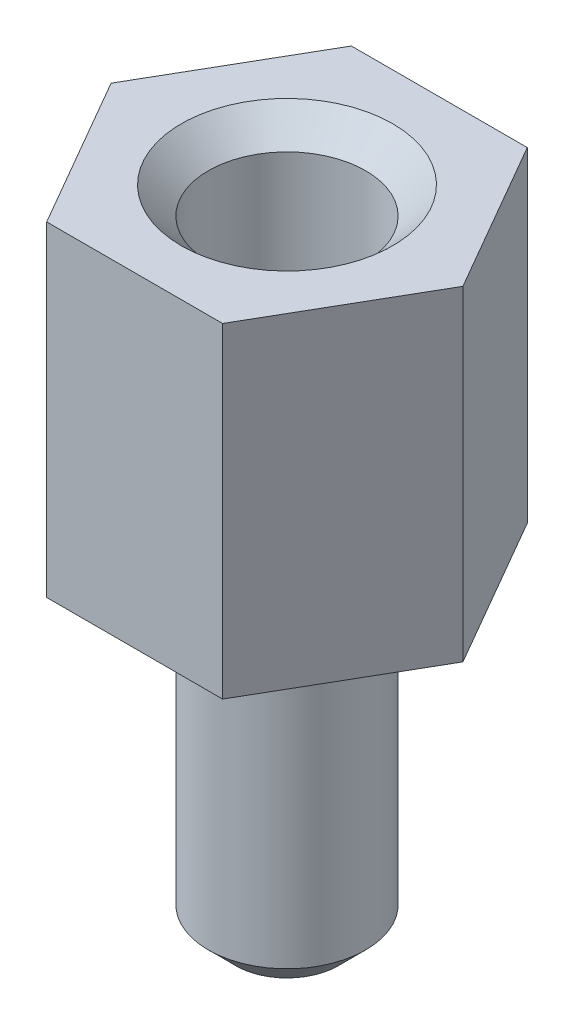
ISO-10303-21;
HEADER;
FILE_DESCRIPTION(('STEP AP214'),'2;1');
FILE_NAME('part.step','',(''),(''),'','','');
FILE_SCHEMA(('AUTOMOTIVE_DESIGN { 1 0 10303 214 1 1 1 1 }'));
ENDSEC;
DATA;
#1=APPLICATION_CONTEXT('core data for automotive mechanical design processes');
#2=APPLICATION_PROTOCOL_DEFINITION('international standard','automotive_design',2000,#1);
#3=PRODUCT_CONTEXT('',#1,'mechanical');
#4=PRODUCT('Part','Part','',(#3));
#5=PRODUCT_RELATED_PRODUCT_CATEGORY('part','',(#4));
#6=PRODUCT_DEFINITION_FORMATION('','',#4);
#7=PRODUCT_DEFINITION_CONTEXT('part definition',#1,'design');
#8=PRODUCT_DEFINITION('design','',#6,#7);
#9=PRODUCT_DEFINITION_SHAPE('','',#8);
#10=(LENGTH_UNIT() NAMED_UNIT(*) SI_UNIT(.MILLI.,.METRE.));
#11=(NAMED_UNIT(*) PLANE_ANGLE_UNIT() SI_UNIT($,.RADIAN.));
#12=(NAMED_UNIT(*) SI_UNIT($,.STERADIAN.) SOLID_ANGLE_UNIT());
#13=UNCERTAINTY_MEASURE_WITH_UNIT(LENGTH_MEASURE(1.E-05),#10,'distance_accuracy_value','');
#14=(GEOMETRIC_REPRESENTATION_CONTEXT(3) GLOBAL_UNCERTAINTY_ASSIGNED_CONTEXT((#13)) GLOBAL_UNIT_ASSIGNED_CONTEXT((#10,
#11,#12)) REPRESENTATION_CONTEXT('',''));
#15=CARTESIAN_POINT('',(0.,0.,0.));
#16=DIRECTION('',(0.,0.,1.));
#17=DIRECTION('',(1.,0.,0.));
#18=AXIS2_PLACEMENT_3D('',#15,#16,#17);
#19=CARTESIAN_POINT('',(-1.62235425642285,0.,2.81));
#20=DIRECTION('',(0.,0.,1.));
#21=DIRECTION('',(1.,0.,0.));
#22=AXIS2_PLACEMENT_3D('',#19,#20,#21);
#23=PLANE('',#22);
#24=DIRECTION('',(1.,0.,0.));
#25=VECTOR('',#24,1.);
#26=CARTESIAN_POINT('',(-1.62235425642285,6.,2.81));
#27=LINE('',#26,#25);
#28=CARTESIAN_POINT('',(-1.62235425642285,6.,2.81));
#29=VERTEX_POINT('',#28);
#30=CARTESIAN_POINT('',(1.62235425642285,6.,2.81));
#31=VERTEX_POINT('',#30);
#32=EDGE_CURVE('E123',#29,#31,#27,.T.);
#33=ORIENTED_EDGE('',*,*,#32,.F.);
#34=DIRECTION('',(0.,1.,0.));
#35=VECTOR('',#34,1.);
#36=CARTESIAN_POINT('',(-1.62235425642285,0.,2.81));
#37=LINE('',#36,#35);
#38=CARTESIAN_POINT('',(-1.62235425642285,0.,2.81));
#39=VERTEX_POINT('',#38);
#40=EDGE_CURVE('E52',#39,#29,#37,.T.);
#41=ORIENTED_EDGE('',*,*,#40,.F.);
#42=DIRECTION('',(1.,0.,0.));
#43=VECTOR('',#42,1.);
#44=CARTESIAN_POINT('',(-1.62235425642285,0.,2.81));
#45=LINE('',#44,#43);
#46=CARTESIAN_POINT('',(1.62235425642285,0.,2.81));
#47=VERTEX_POINT('',#46);
#48=EDGE_CURVE('E139',#39,#47,#45,.T.);
#49=ORIENTED_EDGE('',*,*,#48,.T.);
#50=DIRECTION('',(0.,1.,0.));
#51=VECTOR('',#50,1.);
#52=CARTESIAN_POINT('',(1.62235425642285,0.,2.81));
#53=LINE('',#52,#51);
#54=EDGE_CURVE('E87',#47,#31,#53,.T.);
#55=ORIENTED_EDGE('',*,*,#54,.T.);
#56=EDGE_LOOP('',(#33,#41,#49,#55));
#57=FACE_BOUND('',#56,.T.);
#58=ADVANCED_FACE('F34',(#57),#23,.T.);
#59=CARTESIAN_POINT('',(-3.2447085128457,0.,0.));
#60=DIRECTION('',(-0.866025403784438,0.,0.5));
#61=DIRECTION('',(0.5,0.,0.866025403784439));
#62=AXIS2_PLACEMENT_3D('',#59,#60,#61);
#63=PLANE('',#62);
#64=DIRECTION('',(0.5,0.,0.866025403784438));
#65=VECTOR('',#64,1.);
#66=CARTESIAN_POINT('',(-3.2447085128457,6.,0.));
#67=LINE('',#66,#65);
#68=CARTESIAN_POINT('',(-3.2447085128457,6.,0.));
#69=VERTEX_POINT('',#68);
#70=EDGE_CURVE('E136',#69,#29,#67,.T.);
#71=ORIENTED_EDGE('',*,*,#70,.F.);
#72=DIRECTION('',(0.,1.,0.));
#73=VECTOR('',#72,1.);
#74=CARTESIAN_POINT('',(-3.2447085128457,0.,0.));
#75=LINE('',#74,#73);
#76=CARTESIAN_POINT('',(-3.2447085128457,0.,0.));
#77=VERTEX_POINT('',#76);
#78=EDGE_CURVE('E75',#77,#69,#75,.T.);
#79=ORIENTED_EDGE('',*,*,#78,.F.);
#80=DIRECTION('',(0.5,0.,0.866025403784438));
#81=VECTOR('',#80,1.);
#82=CARTESIAN_POINT('',(-3.2447085128457,0.,0.));
#83=LINE('',#82,#81);
#84=EDGE_CURVE('E113',#77,#39,#83,.T.);
#85=ORIENTED_EDGE('',*,*,#84,.T.);
#86=ORIENTED_EDGE('',*,*,#40,.T.);
#87=EDGE_LOOP('',(#71,#79,#85,#86));
#88=FACE_BOUND('',#87,.T.);
#89=ADVANCED_FACE('F166',(#88),#63,.T.);
#90=CARTESIAN_POINT('',(-1.62235425642285,0.,-2.81));
#91=DIRECTION('',(-0.866025403784438,0.,-0.500000000000001));
#92=DIRECTION('',(-0.500000000000001,0.,0.866025403784438));
#93=AXIS2_PLACEMENT_3D('',#90,#91,#92);
#94=PLANE('',#93);
#95=DIRECTION('',(-0.5,0.,0.866025403784438));
#96=VECTOR('',#95,1.);
#97=CARTESIAN_POINT('',(-1.62235425642285,6.,-2.81));
#98=LINE('',#97,#96);
#99=CARTESIAN_POINT('',(-1.62235425642285,6.,-2.81));
#100=VERTEX_POINT('',#99);
#101=EDGE_CURVE('E100',#100,#69,#98,.T.);
#102=ORIENTED_EDGE('',*,*,#101,.F.);
#103=DIRECTION('',(0.,1.,0.));
#104=VECTOR('',#103,1.);
#105=CARTESIAN_POINT('',(-1.62235425642285,0.,-2.81));
#106=LINE('',#105,#104);
#107=CARTESIAN_POINT('',(-1.62235425642285,0.,-2.81));
#108=VERTEX_POINT('',#107);
#109=EDGE_CURVE('E95',#108,#100,#106,.T.);
#110=ORIENTED_EDGE('',*,*,#109,.F.);
#111=DIRECTION('',(-0.5,0.,0.866025403784438));
#112=VECTOR('',#111,1.);
#113=CARTESIAN_POINT('',(-1.62235425642285,0.,-2.81));
#114=LINE('',#113,#112);
#115=EDGE_CURVE('E98',#108,#77,#114,.T.);
#116=ORIENTED_EDGE('',*,*,#115,.T.);
#117=ORIENTED_EDGE('',*,*,#78,.T.);
#118=EDGE_LOOP('',(#102,#110,#116,#117));
#119=FACE_BOUND('',#118,.T.);
#120=ADVANCED_FACE('F97',(#119),#94,.T.);
#121=CARTESIAN_POINT('',(1.62235425642285,0.,-2.81));
#122=DIRECTION('',(0.,0.,-1.));
#123=DIRECTION('',(-1.,0.,0.));
#124=AXIS2_PLACEMENT_3D('',#121,#122,#123);
#125=PLANE('',#124);
#126=DIRECTION('',(-1.,0.,0.));
#127=VECTOR('',#126,1.);
#128=CARTESIAN_POINT('',(1.62235425642285,6.,-2.81));
#129=LINE('',#128,#127);
#130=CARTESIAN_POINT('',(1.62235425642285,6.,-2.81));
#131=VERTEX_POINT('',#130);
#132=EDGE_CURVE('E133',#131,#100,#129,.T.);
#133=ORIENTED_EDGE('',*,*,#132,.F.);
#134=DIRECTION('',(0.,1.,0.));
#135=VECTOR('',#134,1.);
#136=CARTESIAN_POINT('',(1.62235425642285,0.,-2.81));
#137=LINE('',#136,#135);
#138=CARTESIAN_POINT('',(1.62235425642285,0.,-2.81));
#139=VERTEX_POINT('',#138);
#140=EDGE_CURVE('E105',#139,#131,#137,.T.);
#141=ORIENTED_EDGE('',*,*,#140,.F.);
#142=DIRECTION('',(-1.,0.,0.));
#143=VECTOR('',#142,1.);
#144=CARTESIAN_POINT('',(1.62235425642285,0.,-2.81));
#145=LINE('',#144,#143);
#146=EDGE_CURVE('E111',#139,#108,#145,.T.);
#147=ORIENTED_EDGE('',*,*,#146,.T.);
#148=ORIENTED_EDGE('',*,*,#109,.T.);
#149=EDGE_LOOP('',(#133,#141,#147,#148));
#150=FACE_BOUND('',#149,.T.);
#151=ADVANCED_FACE('F115',(#150),#125,.T.);
#152=CARTESIAN_POINT('',(3.2447085128457,0.,0.));
#153=DIRECTION('',(0.866025403784439,0.,-0.5));
#154=DIRECTION('',(-0.5,0.,-0.866025403784439));
#155=AXIS2_PLACEMENT_3D('',#152,#153,#154);
#156=PLANE('',#155);
#157=DIRECTION('',(-0.5,0.,-0.866025403784438));
#158=VECTOR('',#157,1.);
#159=CARTESIAN_POINT('',(3.2447085128457,6.,0.));
#160=LINE('',#159,#158);
#161=CARTESIAN_POINT('',(3.2447085128457,6.,0.));
#162=VERTEX_POINT('',#161);
#163=EDGE_CURVE('E130',#162,#131,#160,.T.);
#164=ORIENTED_EDGE('',*,*,#163,.F.);
#165=DIRECTION('',(0.,1.,0.));
#166=VECTOR('',#165,1.);
#167=CARTESIAN_POINT('',(3.2447085128457,0.,0.));
#168=LINE('',#167,#166);
#169=CARTESIAN_POINT('',(3.2447085128457,0.,0.));
#170=VERTEX_POINT('',#169);
#171=EDGE_CURVE('E144',#170,#162,#168,.T.);
#172=ORIENTED_EDGE('',*,*,#171,.F.);
#173=DIRECTION('',(-0.5,0.,-0.866025403784438));
#174=VECTOR('',#173,1.);
#175=CARTESIAN_POINT('',(3.2447085128457,0.,0.));
#176=LINE('',#175,#174);
#177=EDGE_CURVE('E116',#170,#139,#176,.T.);
#178=ORIENTED_EDGE('',*,*,#177,.T.);
#179=ORIENTED_EDGE('',*,*,#140,.T.);
#180=EDGE_LOOP('',(#164,#172,#178,#179));
#181=FACE_BOUND('',#180,.T.);
#182=ADVANCED_FACE('F181',(#181),#156,.T.);
#183=CARTESIAN_POINT('',(1.62235425642285,0.,2.81));
#184=DIRECTION('',(0.866025403784438,0.,0.5));
#185=DIRECTION('',(0.5,0.,-0.866025403784438));
#186=AXIS2_PLACEMENT_3D('',#183,#184,#185);
#187=PLANE('',#186);
#188=DIRECTION('',(0.5,0.,-0.866025403784438));
#189=VECTOR('',#188,1.);
#190=CARTESIAN_POINT('',(1.62235425642285,6.,2.81));
#191=LINE('',#190,#189);
#192=EDGE_CURVE('E126',#31,#162,#191,.T.);
#193=ORIENTED_EDGE('',*,*,#192,.F.);
#194=ORIENTED_EDGE('',*,*,#54,.F.);
#195=DIRECTION('',(0.5,0.,-0.866025403784438));
#196=VECTOR('',#195,1.);
#197=CARTESIAN_POINT('',(1.62235425642285,0.,2.81));
#198=LINE('',#197,#196);
#199=EDGE_CURVE('E118',#47,#170,#198,.T.);
#200=ORIENTED_EDGE('',*,*,#199,.T.);
#201=ORIENTED_EDGE('',*,*,#171,.T.);
#202=EDGE_LOOP('',(#193,#194,#200,#201));
#203=FACE_BOUND('',#202,.T.);
#204=ADVANCED_FACE('F173',(#203),#187,.T.);
#205=CARTESIAN_POINT('',(0.,0.,0.));
#206=DIRECTION('',(0.,1.,0.));
#207=DIRECTION('',(0.,0.,1.));
#208=AXIS2_PLACEMENT_3D('',#205,#206,#207);
#209=PLANE('',#208);
#210=CARTESIAN_POINT('',(0.,0.,0.));
#211=DIRECTION('',(0.,1.,0.));
#212=DIRECTION('',(0.,0.,1.));
#213=AXIS2_PLACEMENT_3D('',#210,#211,#212);
#214=CIRCLE('',#213,1.45);
#215=CARTESIAN_POINT('',(0.,0.,1.45));
#216=VERTEX_POINT('',#215);
#217=EDGE_CURVE('E127',#216,#216,#214,.T.);
#218=ORIENTED_EDGE('',*,*,#217,.T.);
#219=EDGE_LOOP('',(#218));
#220=FACE_BOUND('',#219,.T.);
#221=ORIENTED_EDGE('',*,*,#48,.F.);
#222=ORIENTED_EDGE('',*,*,#84,.F.);
#223=ORIENTED_EDGE('',*,*,#115,.F.);
#224=ORIENTED_EDGE('',*,*,#146,.F.);
#225=ORIENTED_EDGE('',*,*,#177,.F.);
#226=ORIENTED_EDGE('',*,*,#199,.F.);
#227=EDGE_LOOP('',(#221,#222,#223,#224,#225,#226));
#228=FACE_BOUND('',#227,.T.);
#229=ADVANCED_FACE('F109',(#220,#228),#209,.F.);
#230=CARTESIAN_POINT('',(0.,6.,0.));
#231=DIRECTION('',(0.,1.,0.));
#232=DIRECTION('',(0.,0.,1.));
#233=AXIS2_PLACEMENT_3D('',#230,#231,#232);
#234=PLANE('',#233);
#235=CARTESIAN_POINT('',(0.,6.,0.));
#236=DIRECTION('',(0.,1.,0.));
#237=DIRECTION('',(0.,0.,1.));
#238=AXIS2_PLACEMENT_3D('',#235,#236,#237);
#239=CIRCLE('',#238,1.94999999999999);
#240=CARTESIAN_POINT('',(0.,6.,1.94999999999999));
#241=VERTEX_POINT('',#240);
#242=EDGE_CURVE('E11',#241,#241,#239,.F.);
#243=ORIENTED_EDGE('',*,*,#242,.T.);
#244=EDGE_LOOP('',(#243));
#245=FACE_BOUND('',#244,.T.);
#246=ORIENTED_EDGE('',*,*,#32,.T.);
#247=ORIENTED_EDGE('',*,*,#192,.T.);
#248=ORIENTED_EDGE('',*,*,#163,.T.);
#249=ORIENTED_EDGE('',*,*,#132,.T.);
#250=ORIENTED_EDGE('',*,*,#101,.T.);
#251=ORIENTED_EDGE('',*,*,#70,.T.);
#252=EDGE_LOOP('',(#246,#247,#248,#249,#250,#251));
#253=FACE_BOUND('',#252,.T.);
#254=ADVANCED_FACE('F189',(#245,#253),#234,.T.);
#255=CARTESIAN_POINT('',(0.,-6.,0.));
#256=DIRECTION('',(0.,1.,0.));
#257=DIRECTION('',(0.,0.,1.));
#258=AXIS2_PLACEMENT_3D('',#255,#256,#257);
#259=CYLINDRICAL_SURFACE('',#258,1.45);
#260=CARTESIAN_POINT('',(0.,-5.5,0.));
#261=DIRECTION('',(0.,-1.,0.));
#262=DIRECTION('',(0.,0.,-1.));
#263=AXIS2_PLACEMENT_3D('',#260,#261,#262);
#264=CIRCLE('',#263,1.45);
#265=CARTESIAN_POINT('',(0.,-5.5,-1.45));
#266=VERTEX_POINT('',#265);
#267=EDGE_CURVE('E141',#266,#266,#264,.F.);
#268=ORIENTED_EDGE('',*,*,#267,.T.);
#269=EDGE_LOOP('',(#268));
#270=FACE_BOUND('',#269,.T.);
#271=ORIENTED_EDGE('',*,*,#217,.F.);
#272=EDGE_LOOP('',(#271));
#273=FACE_BOUND('',#272,.T.);
#274=ADVANCED_FACE('F192',(#270,#273),#259,.T.);
#275=CARTESIAN_POINT('',(1.45,-6.,0.));
#276=DIRECTION('',(0.,-1.,0.));
#277=DIRECTION('',(0.,0.,-1.));
#278=AXIS2_PLACEMENT_3D('',#275,#276,#277);
#279=PLANE('',#278);
#280=CARTESIAN_POINT('',(0.,-6.,0.));
#281=DIRECTION('',(0.,-1.,0.));
#282=DIRECTION('',(0.,0.,-1.));
#283=AXIS2_PLACEMENT_3D('',#280,#281,#282);
#284=CIRCLE('',#283,0.949999999999998);
#285=CARTESIAN_POINT('',(0.,-6.,-0.949999999999998));
#286=VERTEX_POINT('',#285);
#287=EDGE_CURVE('E149',#286,#286,#284,.T.);
#288=ORIENTED_EDGE('',*,*,#287,.T.);
#289=EDGE_LOOP('',(#288));
#290=FACE_BOUND('',#289,.T.);
#291=ADVANCED_FACE('F199',(#290),#279,.T.);
#292=CARTESIAN_POINT('',(0.,1.,0.));
#293=DIRECTION('',(0.,-1.,0.));
#294=DIRECTION('',(0.,0.,-1.));
#295=AXIS2_PLACEMENT_3D('',#292,#293,#294);
#296=PLANE('',#295);
#297=CARTESIAN_POINT('',(0.,0.999999999999996,0.));
#298=DIRECTION('',(0.,1.,0.));
#299=DIRECTION('',(0.,0.,1.));
#300=AXIS2_PLACEMENT_3D('',#297,#298,#299);
#301=CIRCLE('',#300,1.44999999999999);
#302=CARTESIAN_POINT('',(0.,0.999999999999996,1.44999999999999));
#303=VERTEX_POINT('',#302);
#304=EDGE_CURVE('E291',#303,#303,#301,.T.);
#305=ORIENTED_EDGE('',*,*,#304,.T.);
#306=EDGE_LOOP('',(#305));
#307=FACE_BOUND('',#306,.T.);
#308=ADVANCED_FACE('F203',(#307),#296,.F.);
#309=CARTESIAN_POINT('',(0.,6.,0.));
#310=DIRECTION('',(0.,1.,0.));
#311=DIRECTION('',(0.,0.,1.));
#312=AXIS2_PLACEMENT_3D('',#309,#310,#311);
#313=CYLINDRICAL_SURFACE('',#312,1.44999999999999);
#314=CARTESIAN_POINT('',(0.,5.5,0.));
#315=DIRECTION('',(0.,1.,0.));
#316=DIRECTION('',(0.,0.,1.));
#317=AXIS2_PLACEMENT_3D('',#314,#315,#316);
#318=CIRCLE('',#317,1.44999999999999);
#319=CARTESIAN_POINT('',(0.,5.5,1.44999999999999));
#320=VERTEX_POINT('',#319);
#321=EDGE_CURVE('E44',#320,#320,#318,.T.);
#322=ORIENTED_EDGE('',*,*,#321,.T.);
#323=EDGE_LOOP('',(#322));
#324=FACE_BOUND('',#323,.T.);
#325=ORIENTED_EDGE('',*,*,#304,.F.);
#326=EDGE_LOOP('',(#325));
#327=FACE_BOUND('',#326,.T.);
#328=ADVANCED_FACE('F154',(#324,#327),#313,.F.);
#329=CARTESIAN_POINT('',(0.,-5.5,0.));
#330=DIRECTION('',(0.,1.,0.));
#331=DIRECTION('',(0.,0.,1.));
#332=AXIS2_PLACEMENT_3D('',#329,#330,#331);
#333=CONICAL_SURFACE('',#332,1.45,0.785398163397452);
#334=ORIENTED_EDGE('',*,*,#287,.F.);
#335=EDGE_LOOP('',(#334));
#336=FACE_BOUND('',#335,.T.);
#337=ORIENTED_EDGE('',*,*,#267,.F.);
#338=EDGE_LOOP('',(#337));
#339=FACE_BOUND('',#338,.T.);
#340=ADVANCED_FACE('F158',(#336,#339),#333,.T.);
#341=CARTESIAN_POINT('',(0.,5.5,0.));
#342=DIRECTION('',(0.,1.,0.));
#343=DIRECTION('',(0.,0.,1.));
#344=AXIS2_PLACEMENT_3D('',#341,#342,#343);
#345=CONICAL_SURFACE('',#344,1.44999999999999,0.785398163397451);
#346=ORIENTED_EDGE('',*,*,#242,.F.);
#347=EDGE_LOOP('',(#346));
#348=FACE_BOUND('',#347,.T.);
#349=ORIENTED_EDGE('',*,*,#321,.F.);
#350=EDGE_LOOP('',(#349));
#351=FACE_BOUND('',#350,.T.);
#352=ADVANCED_FACE('F37',(#348,#351),#345,.F.);
#353=CLOSED_SHELL('',(#58,#89,#120,#151,#182,#204,#229,#254,#274,#291,#308,#328,#340,#352));
#354=MANIFOLD_SOLID_BREP('B2',#353);
#355=ADVANCED_BREP_SHAPE_REPRESENTATION('',(#18,#354),#14);
#356=SHAPE_DEFINITION_REPRESENTATION(#9,#355);
ENDSEC;
END-ISO-10303-21;
